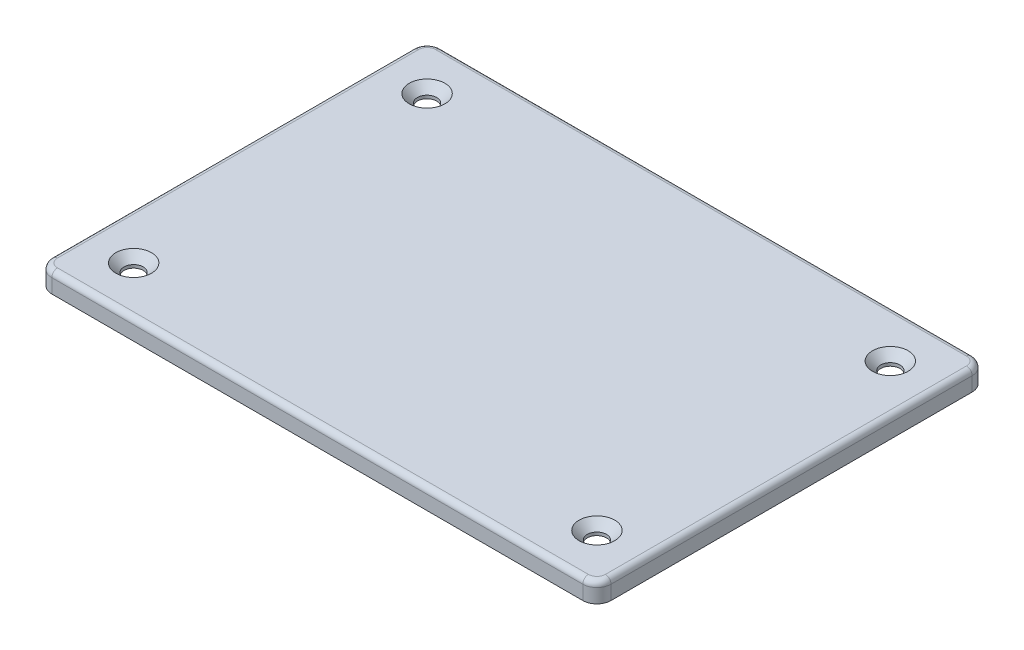
ISO-10303-21;
HEADER;
FILE_DESCRIPTION(('STEP AP214'),'2;1');
FILE_NAME('part.step','',(''),(''),'','','');
FILE_SCHEMA(('AUTOMOTIVE_DESIGN { 1 0 10303 214 1 1 1 1 }'));
ENDSEC;
DATA;
#1=APPLICATION_CONTEXT('core data for automotive mechanical design processes');
#2=APPLICATION_PROTOCOL_DEFINITION('international standard','automotive_design',2000,#1);
#3=PRODUCT_CONTEXT('',#1,'mechanical');
#4=PRODUCT('Part','Part','',(#3));
#5=PRODUCT_RELATED_PRODUCT_CATEGORY('part','',(#4));
#6=PRODUCT_DEFINITION_FORMATION('','',#4);
#7=PRODUCT_DEFINITION_CONTEXT('part definition',#1,'design');
#8=PRODUCT_DEFINITION('design','',#6,#7);
#9=PRODUCT_DEFINITION_SHAPE('','',#8);
#10=(LENGTH_UNIT() NAMED_UNIT(*) SI_UNIT(.MILLI.,.METRE.));
#11=(NAMED_UNIT(*) PLANE_ANGLE_UNIT() SI_UNIT($,.RADIAN.));
#12=(NAMED_UNIT(*) SI_UNIT($,.STERADIAN.) SOLID_ANGLE_UNIT());
#13=UNCERTAINTY_MEASURE_WITH_UNIT(LENGTH_MEASURE(1.E-05),#10,'distance_accuracy_value','');
#14=(GEOMETRIC_REPRESENTATION_CONTEXT(3) GLOBAL_UNCERTAINTY_ASSIGNED_CONTEXT((#13)) GLOBAL_UNIT_ASSIGNED_CONTEXT((#10,
#11,#12)) REPRESENTATION_CONTEXT('',''));
#15=CARTESIAN_POINT('',(0.,0.,0.));
#16=DIRECTION('',(0.,0.,1.));
#17=DIRECTION('',(1.,0.,0.));
#18=AXIS2_PLACEMENT_3D('',#15,#16,#17);
#19=CARTESIAN_POINT('',(0.,3.5,0.));
#20=DIRECTION('',(0.,1.,0.));
#21=DIRECTION('',(0.,0.,1.));
#22=AXIS2_PLACEMENT_3D('',#19,#20,#21);
#23=PLANE('',#22);
#24=CARTESIAN_POINT('',(-40.9119632626517,3.5,-25.9119632626518));
#25=DIRECTION('',(0.,1.,0.));
#26=DIRECTION('',(0.,0.,1.));
#27=AXIS2_PLACEMENT_3D('',#24,#25,#26);
#28=CIRCLE('',#27,3.15);
#29=CARTESIAN_POINT('',(-40.9119632626517,3.5,-22.7619632626518));
#30=VERTEX_POINT('',#29);
#31=EDGE_CURVE('E790',#30,#30,#28,.T.);
#32=ORIENTED_EDGE('',*,*,#31,.F.);
#33=EDGE_LOOP('',(#32));
#34=FACE_BOUND('',#33,.T.);
#35=CARTESIAN_POINT('',(40.911962807627,3.5,-25.9119632626518));
#36=DIRECTION('',(0.,1.,0.));
#37=DIRECTION('',(0.,0.,1.));
#38=AXIS2_PLACEMENT_3D('',#35,#36,#37);
#39=CIRCLE('',#38,3.15);
#40=CARTESIAN_POINT('',(40.911962807627,3.5,-22.7619632626518));
#41=VERTEX_POINT('',#40);
#42=EDGE_CURVE('E363',#41,#41,#39,.T.);
#43=ORIENTED_EDGE('',*,*,#42,.F.);
#44=EDGE_LOOP('',(#43));
#45=FACE_BOUND('',#44,.T.);
#46=CARTESIAN_POINT('',(40.911962807627,3.5,25.911962807627));
#47=DIRECTION('',(0.,1.,0.));
#48=DIRECTION('',(0.,0.,1.));
#49=AXIS2_PLACEMENT_3D('',#46,#47,#48);
#50=CIRCLE('',#49,3.15);
#51=CARTESIAN_POINT('',(40.911962807627,3.5,29.061962807627));
#52=VERTEX_POINT('',#51);
#53=EDGE_CURVE('E356',#52,#52,#50,.T.);
#54=ORIENTED_EDGE('',*,*,#53,.F.);
#55=EDGE_LOOP('',(#54));
#56=FACE_BOUND('',#55,.T.);
#57=CARTESIAN_POINT('',(-40.9119632626517,3.5,25.911962807627));
#58=DIRECTION('',(0.,1.,0.));
#59=DIRECTION('',(0.,0.,1.));
#60=AXIS2_PLACEMENT_3D('',#57,#58,#59);
#61=CIRCLE('',#60,3.15);
#62=CARTESIAN_POINT('',(-40.9119632626517,3.5,29.061962807627));
#63=VERTEX_POINT('',#62);
#64=EDGE_CURVE('E352',#63,#63,#61,.T.);
#65=ORIENTED_EDGE('',*,*,#64,.F.);
#66=EDGE_LOOP('',(#65));
#67=FACE_BOUND('',#66,.T.);
#68=CARTESIAN_POINT('',(46.8890725,3.5,-31.8890725));
#69=DIRECTION('',(0.,1.,0.));
#70=DIRECTION('',(0.,0.,1.));
#71=AXIS2_PLACEMENT_3D('',#68,#69,#70);
#72=CIRCLE('',#71,1.5);
#73=CARTESIAN_POINT('',(46.8890725,3.5,-33.3890725));
#74=VERTEX_POINT('',#73);
#75=CARTESIAN_POINT('',(48.3890725,3.5,-31.8890725));
#76=VERTEX_POINT('',#75);
#77=EDGE_CURVE('E303',#74,#76,#72,.F.);
#78=ORIENTED_EDGE('',*,*,#77,.F.);
#79=DIRECTION('',(-1.,0.,0.));
#80=VECTOR('',#79,1.);
#81=CARTESIAN_POINT('',(-49.3890725,3.5,-33.3890725));
#82=LINE('',#81,#80);
#83=CARTESIAN_POINT('',(-46.8890725,3.5,-33.3890725));
#84=VERTEX_POINT('',#83);
#85=EDGE_CURVE('E275',#74,#84,#82,.T.);
#86=ORIENTED_EDGE('',*,*,#85,.T.);
#87=CARTESIAN_POINT('',(-46.8890725,3.5,-31.8890725));
#88=DIRECTION('',(0.,1.,0.));
#89=DIRECTION('',(0.,0.,1.));
#90=AXIS2_PLACEMENT_3D('',#87,#88,#89);
#91=CIRCLE('',#90,1.5);
#92=CARTESIAN_POINT('',(-48.3890725,3.5,-31.8890725));
#93=VERTEX_POINT('',#92);
#94=EDGE_CURVE('E300',#93,#84,#91,.F.);
#95=ORIENTED_EDGE('',*,*,#94,.F.);
#96=DIRECTION('',(0.,0.,1.));
#97=VECTOR('',#96,1.);
#98=CARTESIAN_POINT('',(-48.3890725,3.5,34.3890725));
#99=LINE('',#98,#97);
#100=CARTESIAN_POINT('',(-48.3890725,3.5,31.8890725));
#101=VERTEX_POINT('',#100);
#102=EDGE_CURVE('E266',#93,#101,#99,.T.);
#103=ORIENTED_EDGE('',*,*,#102,.T.);
#104=CARTESIAN_POINT('',(-46.8890725,3.5,31.8890725));
#105=DIRECTION('',(0.,1.,0.));
#106=DIRECTION('',(0.,0.,1.));
#107=AXIS2_PLACEMENT_3D('',#104,#105,#106);
#108=CIRCLE('',#107,1.5);
#109=CARTESIAN_POINT('',(-46.8890725,3.5,33.3890725));
#110=VERTEX_POINT('',#109);
#111=EDGE_CURVE('E297',#110,#101,#108,.F.);
#112=ORIENTED_EDGE('',*,*,#111,.F.);
#113=DIRECTION('',(1.,0.,0.));
#114=VECTOR('',#113,1.);
#115=CARTESIAN_POINT('',(49.3890725,3.5,33.3890725));
#116=LINE('',#115,#114);
#117=CARTESIAN_POINT('',(46.8890725,3.5,33.3890725));
#118=VERTEX_POINT('',#117);
#119=EDGE_CURVE('E269',#110,#118,#116,.T.);
#120=ORIENTED_EDGE('',*,*,#119,.T.);
#121=CARTESIAN_POINT('',(46.8890725,3.5,31.8890725));
#122=DIRECTION('',(0.,1.,0.));
#123=DIRECTION('',(0.,0.,1.));
#124=AXIS2_PLACEMENT_3D('',#121,#122,#123);
#125=CIRCLE('',#124,1.5);
#126=CARTESIAN_POINT('',(48.3890725,3.5,31.8890725));
#127=VERTEX_POINT('',#126);
#128=EDGE_CURVE('E295',#127,#118,#125,.F.);
#129=ORIENTED_EDGE('',*,*,#128,.F.);
#130=DIRECTION('',(0.,0.,-1.));
#131=VECTOR('',#130,1.);
#132=CARTESIAN_POINT('',(48.3890725,3.5,-34.3890725));
#133=LINE('',#132,#131);
#134=EDGE_CURVE('E272',#127,#76,#133,.T.);
#135=ORIENTED_EDGE('',*,*,#134,.T.);
#136=EDGE_LOOP('',(#78,#86,#95,#103,#112,#120,#129,#135));
#137=FACE_BOUND('',#136,.T.);
#138=ADVANCED_FACE('F39',(#34,#45,#56,#67,#137),#23,.T.);
#139=CARTESIAN_POINT('',(-49.3890725,3.5,34.3890725));
#140=DIRECTION('',(1.,0.,0.));
#141=DIRECTION('',(0.,0.,-1.));
#142=AXIS2_PLACEMENT_3D('',#139,#140,#141);
#143=PLANE('',#142);
#144=DIRECTION('',(0.,0.,1.));
#145=VECTOR('',#144,1.);
#146=CARTESIAN_POINT('',(-49.3890725,0.,34.3890725));
#147=LINE('',#146,#145);
#148=CARTESIAN_POINT('',(-49.3890725,0.,-31.8890725));
#149=VERTEX_POINT('',#148);
#150=CARTESIAN_POINT('',(-49.3890725,0.,31.8890725));
#151=VERTEX_POINT('',#150);
#152=EDGE_CURVE('E254',#149,#151,#147,.T.);
#153=ORIENTED_EDGE('',*,*,#152,.T.);
#154=DIRECTION('',(0.,-1.,0.));
#155=VECTOR('',#154,1.);
#156=CARTESIAN_POINT('',(-49.3890725,3.5,31.8890725));
#157=LINE('',#156,#155);
#158=CARTESIAN_POINT('',(-49.3890725,2.5,31.8890725));
#159=VERTEX_POINT('',#158);
#160=EDGE_CURVE('E335',#151,#159,#157,.F.);
#161=ORIENTED_EDGE('',*,*,#160,.T.);
#162=DIRECTION('',(0.,0.,1.));
#163=VECTOR('',#162,1.);
#164=CARTESIAN_POINT('',(-49.3890725,2.5,-34.3890725));
#165=LINE('',#164,#163);
#166=CARTESIAN_POINT('',(-49.3890725,2.5,-31.8890725));
#167=VERTEX_POINT('',#166);
#168=EDGE_CURVE('E287',#159,#167,#165,.F.);
#169=ORIENTED_EDGE('',*,*,#168,.T.);
#170=DIRECTION('',(0.,-1.,0.));
#171=VECTOR('',#170,1.);
#172=CARTESIAN_POINT('',(-49.3890725,3.5,-31.8890725));
#173=LINE('',#172,#171);
#174=EDGE_CURVE('E333',#167,#149,#173,.T.);
#175=ORIENTED_EDGE('',*,*,#174,.T.);
#176=EDGE_LOOP('',(#153,#161,#169,#175));
#177=FACE_BOUND('',#176,.T.);
#178=ADVANCED_FACE('F394',(#177),#143,.F.);
#179=CARTESIAN_POINT('',(49.3890725,3.5,34.3890725));
#180=DIRECTION('',(0.,0.,-1.));
#181=DIRECTION('',(-1.,0.,0.));
#182=AXIS2_PLACEMENT_3D('',#179,#180,#181);
#183=PLANE('',#182);
#184=DIRECTION('',(1.,0.,0.));
#185=VECTOR('',#184,1.);
#186=CARTESIAN_POINT('',(49.3890725,0.,34.3890725));
#187=LINE('',#186,#185);
#188=CARTESIAN_POINT('',(-46.8890725,0.,34.3890725));
#189=VERTEX_POINT('',#188);
#190=CARTESIAN_POINT('',(46.8890725,0.,34.3890725));
#191=VERTEX_POINT('',#190);
#192=EDGE_CURVE('E257',#189,#191,#187,.T.);
#193=ORIENTED_EDGE('',*,*,#192,.T.);
#194=DIRECTION('',(0.,-1.,0.));
#195=VECTOR('',#194,1.);
#196=CARTESIAN_POINT('',(46.8890725,3.5,34.3890725));
#197=LINE('',#196,#195);
#198=CARTESIAN_POINT('',(46.8890725,2.5,34.3890725));
#199=VERTEX_POINT('',#198);
#200=EDGE_CURVE('E331',#191,#199,#197,.F.);
#201=ORIENTED_EDGE('',*,*,#200,.T.);
#202=DIRECTION('',(1.,0.,0.));
#203=VECTOR('',#202,1.);
#204=CARTESIAN_POINT('',(-49.3890725,2.5,34.3890725));
#205=LINE('',#204,#203);
#206=CARTESIAN_POINT('',(-46.8890725,2.5,34.3890725));
#207=VERTEX_POINT('',#206);
#208=EDGE_CURVE('E284',#199,#207,#205,.F.);
#209=ORIENTED_EDGE('',*,*,#208,.T.);
#210=DIRECTION('',(0.,-1.,0.));
#211=VECTOR('',#210,1.);
#212=CARTESIAN_POINT('',(-46.8890725,3.5,34.3890725));
#213=LINE('',#212,#211);
#214=EDGE_CURVE('E329',#207,#189,#213,.T.);
#215=ORIENTED_EDGE('',*,*,#214,.T.);
#216=EDGE_LOOP('',(#193,#201,#209,#215));
#217=FACE_BOUND('',#216,.T.);
#218=ADVANCED_FACE('F402',(#217),#183,.F.);
#219=CARTESIAN_POINT('',(49.3890725,3.5,34.3890725));
#220=DIRECTION('',(-1.,0.,0.));
#221=DIRECTION('',(0.,0.,1.));
#222=AXIS2_PLACEMENT_3D('',#219,#220,#221);
#223=PLANE('',#222);
#224=DIRECTION('',(0.,0.,-1.));
#225=VECTOR('',#224,1.);
#226=CARTESIAN_POINT('',(49.3890725,2.5,34.3890725));
#227=LINE('',#226,#225);
#228=CARTESIAN_POINT('',(49.3890725,2.5,-31.8890725));
#229=VERTEX_POINT('',#228);
#230=CARTESIAN_POINT('',(49.3890725,2.5,31.8890725));
#231=VERTEX_POINT('',#230);
#232=EDGE_CURVE('E281',#229,#231,#227,.F.);
#233=ORIENTED_EDGE('',*,*,#232,.T.);
#234=DIRECTION('',(0.,-1.,0.));
#235=VECTOR('',#234,1.);
#236=CARTESIAN_POINT('',(49.3890725,3.5,31.8890725));
#237=LINE('',#236,#235);
#238=CARTESIAN_POINT('',(49.3890725,0.,31.8890725));
#239=VERTEX_POINT('',#238);
#240=EDGE_CURVE('E320',#231,#239,#237,.T.);
#241=ORIENTED_EDGE('',*,*,#240,.T.);
#242=DIRECTION('',(0.,0.,-1.));
#243=VECTOR('',#242,1.);
#244=CARTESIAN_POINT('',(49.3890725,0.,34.3890725));
#245=LINE('',#244,#243);
#246=CARTESIAN_POINT('',(49.3890725,0.,-31.8890725));
#247=VERTEX_POINT('',#246);
#248=EDGE_CURVE('E260',#239,#247,#245,.T.);
#249=ORIENTED_EDGE('',*,*,#248,.T.);
#250=DIRECTION('',(0.,-1.,0.));
#251=VECTOR('',#250,1.);
#252=CARTESIAN_POINT('',(49.3890725,3.5,-31.8890725));
#253=LINE('',#252,#251);
#254=EDGE_CURVE('E318',#247,#229,#253,.F.);
#255=ORIENTED_EDGE('',*,*,#254,.T.);
#256=EDGE_LOOP('',(#233,#241,#249,#255));
#257=FACE_BOUND('',#256,.T.);
#258=ADVANCED_FACE('F418',(#257),#223,.F.);
#259=CARTESIAN_POINT('',(49.3890725,3.5,-34.3890725));
#260=DIRECTION('',(0.,0.,1.));
#261=DIRECTION('',(1.,0.,0.));
#262=AXIS2_PLACEMENT_3D('',#259,#260,#261);
#263=PLANE('',#262);
#264=DIRECTION('',(-1.,0.,0.));
#265=VECTOR('',#264,1.);
#266=CARTESIAN_POINT('',(49.3890725,0.,-34.3890725));
#267=LINE('',#266,#265);
#268=CARTESIAN_POINT('',(46.8890725,0.,-34.3890725));
#269=VERTEX_POINT('',#268);
#270=CARTESIAN_POINT('',(-46.8890725,0.,-34.3890725));
#271=VERTEX_POINT('',#270);
#272=EDGE_CURVE('E263',#269,#271,#267,.T.);
#273=ORIENTED_EDGE('',*,*,#272,.T.);
#274=DIRECTION('',(0.,-1.,0.));
#275=VECTOR('',#274,1.);
#276=CARTESIAN_POINT('',(-46.8890725,3.5,-34.3890725));
#277=LINE('',#276,#275);
#278=CARTESIAN_POINT('',(-46.8890725,2.5,-34.3890725));
#279=VERTEX_POINT('',#278);
#280=EDGE_CURVE('E11',#271,#279,#277,.F.);
#281=ORIENTED_EDGE('',*,*,#280,.T.);
#282=DIRECTION('',(-1.,0.,0.));
#283=VECTOR('',#282,1.);
#284=CARTESIAN_POINT('',(49.3890725,2.5,-34.3890725));
#285=LINE('',#284,#283);
#286=CARTESIAN_POINT('',(46.8890725,2.5,-34.3890725));
#287=VERTEX_POINT('',#286);
#288=EDGE_CURVE('E278',#279,#287,#285,.F.);
#289=ORIENTED_EDGE('',*,*,#288,.T.);
#290=DIRECTION('',(0.,-1.,0.));
#291=VECTOR('',#290,1.);
#292=CARTESIAN_POINT('',(46.8890725,3.5,-34.3890725));
#293=LINE('',#292,#291);
#294=EDGE_CURVE('E48',#287,#269,#293,.T.);
#295=ORIENTED_EDGE('',*,*,#294,.T.);
#296=EDGE_LOOP('',(#273,#281,#289,#295));
#297=FACE_BOUND('',#296,.T.);
#298=ADVANCED_FACE('F414',(#297),#263,.F.);
#299=CARTESIAN_POINT('',(0.,0.,0.));
#300=DIRECTION('',(0.,1.,0.));
#301=DIRECTION('',(0.,0.,1.));
#302=AXIS2_PLACEMENT_3D('',#299,#300,#301);
#303=PLANE('',#302);
#304=DIRECTION('',(0.,0.,1.));
#305=VECTOR('',#304,1.);
#306=CARTESIAN_POINT('',(47.8890725,0.,-31.8890725));
#307=LINE('',#306,#305);
#308=CARTESIAN_POINT('',(47.8890725,0.,-31.8890725));
#309=VERTEX_POINT('',#308);
#310=CARTESIAN_POINT('',(47.8890725,0.,31.8890725));
#311=VERTEX_POINT('',#310);
#312=EDGE_CURVE('E223',#309,#311,#307,.T.);
#313=ORIENTED_EDGE('',*,*,#312,.F.);
#314=CARTESIAN_POINT('',(46.8890725,0.,-31.8890725));
#315=DIRECTION('',(0.,-1.,0.));
#316=DIRECTION('',(0.,0.,-1.));
#317=AXIS2_PLACEMENT_3D('',#314,#315,#316);
#318=CIRCLE('',#317,1.);
#319=CARTESIAN_POINT('',(46.8890725,0.,-32.8890725));
#320=VERTEX_POINT('',#319);
#321=EDGE_CURVE('E56',#320,#309,#318,.T.);
#322=ORIENTED_EDGE('',*,*,#321,.F.);
#323=DIRECTION('',(1.,0.,0.));
#324=VECTOR('',#323,1.);
#325=CARTESIAN_POINT('',(-46.8890725,0.,-32.8890725));
#326=LINE('',#325,#324);
#327=CARTESIAN_POINT('',(-46.8890725,0.,-32.8890725));
#328=VERTEX_POINT('',#327);
#329=EDGE_CURVE('E200',#328,#320,#326,.T.);
#330=ORIENTED_EDGE('',*,*,#329,.F.);
#331=CARTESIAN_POINT('',(-46.8890725,0.,-31.8890725));
#332=DIRECTION('',(0.,-1.,0.));
#333=DIRECTION('',(0.,0.,-1.));
#334=AXIS2_PLACEMENT_3D('',#331,#332,#333);
#335=CIRCLE('',#334,1.);
#336=CARTESIAN_POINT('',(-47.8890725,0.,-31.8890725));
#337=VERTEX_POINT('',#336);
#338=EDGE_CURVE('E203',#337,#328,#335,.T.);
#339=ORIENTED_EDGE('',*,*,#338,.F.);
#340=DIRECTION('',(0.,0.,-1.));
#341=VECTOR('',#340,1.);
#342=CARTESIAN_POINT('',(-47.8890725,0.,31.8890725));
#343=LINE('',#342,#341);
#344=CARTESIAN_POINT('',(-47.8890725,0.,31.8890725));
#345=VERTEX_POINT('',#344);
#346=EDGE_CURVE('E235',#345,#337,#343,.T.);
#347=ORIENTED_EDGE('',*,*,#346,.F.);
#348=CARTESIAN_POINT('',(-46.8890725,0.,31.8890725));
#349=DIRECTION('',(0.,-1.,0.));
#350=DIRECTION('',(0.,0.,-1.));
#351=AXIS2_PLACEMENT_3D('',#348,#349,#350);
#352=CIRCLE('',#351,1.);
#353=CARTESIAN_POINT('',(-46.8890725,0.,32.8890725));
#354=VERTEX_POINT('',#353);
#355=EDGE_CURVE('E232',#354,#345,#352,.T.);
#356=ORIENTED_EDGE('',*,*,#355,.F.);
#357=DIRECTION('',(-1.,0.,0.));
#358=VECTOR('',#357,1.);
#359=CARTESIAN_POINT('',(46.8890725,0.,32.8890725));
#360=LINE('',#359,#358);
#361=CARTESIAN_POINT('',(46.8890725,0.,32.8890725));
#362=VERTEX_POINT('',#361);
#363=EDGE_CURVE('E229',#362,#354,#360,.T.);
#364=ORIENTED_EDGE('',*,*,#363,.F.);
#365=CARTESIAN_POINT('',(46.8890725,0.,31.8890725));
#366=DIRECTION('',(0.,-1.,0.));
#367=DIRECTION('',(0.,0.,-1.));
#368=AXIS2_PLACEMENT_3D('',#365,#366,#367);
#369=CIRCLE('',#368,1.);
#370=EDGE_CURVE('E226',#311,#362,#369,.T.);
#371=ORIENTED_EDGE('',*,*,#370,.F.);
#372=EDGE_LOOP('',(#313,#322,#330,#339,#347,#356,#364,#371));
#373=FACE_BOUND('',#372,.T.);
#374=ORIENTED_EDGE('',*,*,#248,.F.);
#375=CARTESIAN_POINT('',(46.8890725,0.,31.8890725));
#376=DIRECTION('',(0.,1.,0.));
#377=DIRECTION('',(0.,0.,1.));
#378=AXIS2_PLACEMENT_3D('',#375,#376,#377);
#379=CIRCLE('',#378,2.5);
#380=EDGE_CURVE('E64',#239,#191,#379,.F.);
#381=ORIENTED_EDGE('',*,*,#380,.T.);
#382=ORIENTED_EDGE('',*,*,#192,.F.);
#383=CARTESIAN_POINT('',(-46.8890725,0.,31.8890725));
#384=DIRECTION('',(0.,1.,0.));
#385=DIRECTION('',(0.,0.,1.));
#386=AXIS2_PLACEMENT_3D('',#383,#384,#385);
#387=CIRCLE('',#386,2.5);
#388=EDGE_CURVE('E326',#189,#151,#387,.F.);
#389=ORIENTED_EDGE('',*,*,#388,.T.);
#390=ORIENTED_EDGE('',*,*,#152,.F.);
#391=CARTESIAN_POINT('',(-46.8890725,0.,-31.8890725));
#392=DIRECTION('',(0.,1.,0.));
#393=DIRECTION('',(0.,0.,1.));
#394=AXIS2_PLACEMENT_3D('',#391,#392,#393);
#395=CIRCLE('',#394,2.5);
#396=EDGE_CURVE('E324',#149,#271,#395,.F.);
#397=ORIENTED_EDGE('',*,*,#396,.T.);
#398=ORIENTED_EDGE('',*,*,#272,.F.);
#399=CARTESIAN_POINT('',(46.8890725,0.,-31.8890725));
#400=DIRECTION('',(0.,1.,0.));
#401=DIRECTION('',(0.,0.,1.));
#402=AXIS2_PLACEMENT_3D('',#399,#400,#401);
#403=CIRCLE('',#402,2.5);
#404=EDGE_CURVE('E322',#269,#247,#403,.F.);
#405=ORIENTED_EDGE('',*,*,#404,.T.);
#406=EDGE_LOOP('',(#374,#381,#382,#389,#390,#397,#398,#405));
#407=FACE_BOUND('',#406,.T.);
#408=ADVANCED_FACE('F410',(#373,#407),#303,.F.);
#409=CARTESIAN_POINT('',(0.,2.5,33.3890725));
#410=DIRECTION('',(-1.,0.,0.));
#411=DIRECTION('',(0.,0.,1.));
#412=AXIS2_PLACEMENT_3D('',#409,#410,#411);
#413=CYLINDRICAL_SURFACE('',#412,1.);
#414=ORIENTED_EDGE('',*,*,#208,.F.);
#415=CARTESIAN_POINT('',(46.8890725,2.5,33.3890725));
#416=DIRECTION('',(-1.,0.,0.));
#417=DIRECTION('',(0.,0.,1.));
#418=AXIS2_PLACEMENT_3D('',#415,#416,#417);
#419=CIRCLE('',#418,1.);
#420=EDGE_CURVE('E315',#199,#118,#419,.T.);
#421=ORIENTED_EDGE('',*,*,#420,.T.);
#422=ORIENTED_EDGE('',*,*,#119,.F.);
#423=CARTESIAN_POINT('',(-46.8890725,2.5,33.3890725));
#424=DIRECTION('',(1.,0.,0.));
#425=DIRECTION('',(0.,0.,-1.));
#426=AXIS2_PLACEMENT_3D('',#423,#424,#425);
#427=CIRCLE('',#426,1.);
#428=EDGE_CURVE('E313',#110,#207,#427,.T.);
#429=ORIENTED_EDGE('',*,*,#428,.T.);
#430=EDGE_LOOP('',(#414,#421,#422,#429));
#431=FACE_BOUND('',#430,.T.);
#432=ADVANCED_FACE('F413',(#431),#413,.T.);
#433=CARTESIAN_POINT('',(48.3890725,2.5,0.));
#434=DIRECTION('',(0.,0.,1.));
#435=DIRECTION('',(1.,0.,0.));
#436=AXIS2_PLACEMENT_3D('',#433,#434,#435);
#437=CYLINDRICAL_SURFACE('',#436,1.);
#438=ORIENTED_EDGE('',*,*,#232,.F.);
#439=CARTESIAN_POINT('',(48.3890725,2.5,-31.8890725));
#440=DIRECTION('',(0.,0.,1.));
#441=DIRECTION('',(1.,0.,0.));
#442=AXIS2_PLACEMENT_3D('',#439,#440,#441);
#443=CIRCLE('',#442,1.);
#444=EDGE_CURVE('E292',#229,#76,#443,.T.);
#445=ORIENTED_EDGE('',*,*,#444,.T.);
#446=ORIENTED_EDGE('',*,*,#134,.F.);
#447=CARTESIAN_POINT('',(48.3890725,2.5,31.8890725));
#448=DIRECTION('',(0.,0.,-1.));
#449=DIRECTION('',(-1.,0.,0.));
#450=AXIS2_PLACEMENT_3D('',#447,#448,#449);
#451=CIRCLE('',#450,1.);
#452=EDGE_CURVE('E290',#127,#231,#451,.T.);
#453=ORIENTED_EDGE('',*,*,#452,.T.);
#454=EDGE_LOOP('',(#438,#445,#446,#453));
#455=FACE_BOUND('',#454,.T.);
#456=ADVANCED_FACE('F434',(#455),#437,.T.);
#457=CARTESIAN_POINT('',(-48.3890725,2.5,0.));
#458=DIRECTION('',(0.,0.,-1.));
#459=DIRECTION('',(-1.,0.,0.));
#460=AXIS2_PLACEMENT_3D('',#457,#458,#459);
#461=CYLINDRICAL_SURFACE('',#460,1.);
#462=ORIENTED_EDGE('',*,*,#168,.F.);
#463=CARTESIAN_POINT('',(-48.3890725,2.5,31.8890725));
#464=DIRECTION('',(0.,0.,-1.));
#465=DIRECTION('',(-1.,0.,0.));
#466=AXIS2_PLACEMENT_3D('',#463,#464,#465);
#467=CIRCLE('',#466,1.);
#468=EDGE_CURVE('E311',#159,#101,#467,.T.);
#469=ORIENTED_EDGE('',*,*,#468,.T.);
#470=ORIENTED_EDGE('',*,*,#102,.F.);
#471=CARTESIAN_POINT('',(-48.3890725,2.5,-31.8890725));
#472=DIRECTION('',(0.,0.,1.));
#473=DIRECTION('',(1.,0.,0.));
#474=AXIS2_PLACEMENT_3D('',#471,#472,#473);
#475=CIRCLE('',#474,1.);
#476=EDGE_CURVE('E309',#93,#167,#475,.T.);
#477=ORIENTED_EDGE('',*,*,#476,.T.);
#478=EDGE_LOOP('',(#462,#469,#470,#477));
#479=FACE_BOUND('',#478,.T.);
#480=ADVANCED_FACE('F430',(#479),#461,.T.);
#481=CARTESIAN_POINT('',(0.,2.5,-33.3890725));
#482=DIRECTION('',(1.,0.,0.));
#483=DIRECTION('',(0.,0.,-1.));
#484=AXIS2_PLACEMENT_3D('',#481,#482,#483);
#485=CYLINDRICAL_SURFACE('',#484,1.);
#486=ORIENTED_EDGE('',*,*,#288,.F.);
#487=CARTESIAN_POINT('',(-46.8890725,2.5,-33.3890725));
#488=DIRECTION('',(1.,0.,0.));
#489=DIRECTION('',(0.,0.,-1.));
#490=AXIS2_PLACEMENT_3D('',#487,#488,#489);
#491=CIRCLE('',#490,1.);
#492=EDGE_CURVE('E307',#279,#84,#491,.T.);
#493=ORIENTED_EDGE('',*,*,#492,.T.);
#494=ORIENTED_EDGE('',*,*,#85,.F.);
#495=CARTESIAN_POINT('',(46.8890725,2.5,-33.3890725));
#496=DIRECTION('',(-1.,0.,0.));
#497=DIRECTION('',(0.,0.,1.));
#498=AXIS2_PLACEMENT_3D('',#495,#496,#497);
#499=CIRCLE('',#498,1.);
#500=EDGE_CURVE('E305',#74,#287,#499,.T.);
#501=ORIENTED_EDGE('',*,*,#500,.T.);
#502=EDGE_LOOP('',(#486,#493,#494,#501));
#503=FACE_BOUND('',#502,.T.);
#504=ADVANCED_FACE('F426',(#503),#485,.T.);
#505=CARTESIAN_POINT('',(46.8890725,3.5,-31.8890725));
#506=DIRECTION('',(0.,-1.,0.));
#507=DIRECTION('',(0.,0.,-1.));
#508=AXIS2_PLACEMENT_3D('',#505,#506,#507);
#509=CYLINDRICAL_SURFACE('',#508,2.5);
#510=ORIENTED_EDGE('',*,*,#404,.F.);
#511=ORIENTED_EDGE('',*,*,#294,.F.);
#512=CARTESIAN_POINT('',(46.8890725,2.5,-31.8890725));
#513=DIRECTION('',(0.,1.,0.));
#514=DIRECTION('',(0.,0.,1.));
#515=AXIS2_PLACEMENT_3D('',#512,#513,#514);
#516=CIRCLE('',#515,2.5);
#517=EDGE_CURVE('E258',#229,#287,#516,.T.);
#518=ORIENTED_EDGE('',*,*,#517,.F.);
#519=ORIENTED_EDGE('',*,*,#254,.F.);
#520=EDGE_LOOP('',(#510,#511,#518,#519));
#521=FACE_BOUND('',#520,.T.);
#522=ADVANCED_FACE('F429',(#521),#509,.T.);
#523=CARTESIAN_POINT('',(46.8890725,2.5,-31.8890725));
#524=DIRECTION('',(0.,1.,0.));
#525=DIRECTION('',(0.,0.,1.));
#526=AXIS2_PLACEMENT_3D('',#523,#524,#525);
#527=TOROIDAL_SURFACE('',#526,1.5,1.);
#528=ORIENTED_EDGE('',*,*,#444,.F.);
#529=ORIENTED_EDGE('',*,*,#517,.T.);
#530=ORIENTED_EDGE('',*,*,#500,.F.);
#531=ORIENTED_EDGE('',*,*,#77,.T.);
#532=EDGE_LOOP('',(#528,#529,#530,#531));
#533=FACE_BOUND('',#532,.T.);
#534=ADVANCED_FACE('F442',(#533),#527,.T.);
#535=CARTESIAN_POINT('',(-46.8890725,3.5,-31.8890725));
#536=DIRECTION('',(0.,-1.,0.));
#537=DIRECTION('',(0.,0.,-1.));
#538=AXIS2_PLACEMENT_3D('',#535,#536,#537);
#539=CYLINDRICAL_SURFACE('',#538,2.5);
#540=ORIENTED_EDGE('',*,*,#396,.F.);
#541=ORIENTED_EDGE('',*,*,#174,.F.);
#542=CARTESIAN_POINT('',(-46.8890725,2.5,-31.8890725));
#543=DIRECTION('',(0.,1.,0.));
#544=DIRECTION('',(0.,0.,1.));
#545=AXIS2_PLACEMENT_3D('',#542,#543,#544);
#546=CIRCLE('',#545,2.5);
#547=EDGE_CURVE('E340',#279,#167,#546,.T.);
#548=ORIENTED_EDGE('',*,*,#547,.F.);
#549=ORIENTED_EDGE('',*,*,#280,.F.);
#550=EDGE_LOOP('',(#540,#541,#548,#549));
#551=FACE_BOUND('',#550,.T.);
#552=ADVANCED_FACE('F445',(#551),#539,.T.);
#553=CARTESIAN_POINT('',(-46.8890725,2.5,-31.8890725));
#554=DIRECTION('',(0.,1.,0.));
#555=DIRECTION('',(0.,0.,1.));
#556=AXIS2_PLACEMENT_3D('',#553,#554,#555);
#557=TOROIDAL_SURFACE('',#556,1.5,1.);
#558=ORIENTED_EDGE('',*,*,#476,.F.);
#559=ORIENTED_EDGE('',*,*,#94,.T.);
#560=ORIENTED_EDGE('',*,*,#492,.F.);
#561=ORIENTED_EDGE('',*,*,#547,.T.);
#562=EDGE_LOOP('',(#558,#559,#560,#561));
#563=FACE_BOUND('',#562,.T.);
#564=ADVANCED_FACE('F450',(#563),#557,.T.);
#565=CARTESIAN_POINT('',(-46.8890725,3.5,31.8890725));
#566=DIRECTION('',(0.,-1.,0.));
#567=DIRECTION('',(0.,0.,-1.));
#568=AXIS2_PLACEMENT_3D('',#565,#566,#567);
#569=CYLINDRICAL_SURFACE('',#568,2.5);
#570=ORIENTED_EDGE('',*,*,#388,.F.);
#571=ORIENTED_EDGE('',*,*,#214,.F.);
#572=CARTESIAN_POINT('',(-46.8890725,2.5,31.8890725));
#573=DIRECTION('',(0.,1.,0.));
#574=DIRECTION('',(0.,0.,1.));
#575=AXIS2_PLACEMENT_3D('',#572,#573,#574);
#576=CIRCLE('',#575,2.5);
#577=EDGE_CURVE('E343',#159,#207,#576,.T.);
#578=ORIENTED_EDGE('',*,*,#577,.F.);
#579=ORIENTED_EDGE('',*,*,#160,.F.);
#580=EDGE_LOOP('',(#570,#571,#578,#579));
#581=FACE_BOUND('',#580,.T.);
#582=ADVANCED_FACE('F453',(#581),#569,.T.);
#583=CARTESIAN_POINT('',(-46.8890725,2.5,31.8890725));
#584=DIRECTION('',(0.,1.,0.));
#585=DIRECTION('',(0.,0.,1.));
#586=AXIS2_PLACEMENT_3D('',#583,#584,#585);
#587=TOROIDAL_SURFACE('',#586,1.5,1.);
#588=ORIENTED_EDGE('',*,*,#428,.F.);
#589=ORIENTED_EDGE('',*,*,#111,.T.);
#590=ORIENTED_EDGE('',*,*,#468,.F.);
#591=ORIENTED_EDGE('',*,*,#577,.T.);
#592=EDGE_LOOP('',(#588,#589,#590,#591));
#593=FACE_BOUND('',#592,.T.);
#594=ADVANCED_FACE('F458',(#593),#587,.T.);
#595=CARTESIAN_POINT('',(46.8890725,3.5,31.8890725));
#596=DIRECTION('',(0.,-1.,0.));
#597=DIRECTION('',(0.,0.,-1.));
#598=AXIS2_PLACEMENT_3D('',#595,#596,#597);
#599=CYLINDRICAL_SURFACE('',#598,2.5);
#600=ORIENTED_EDGE('',*,*,#380,.F.);
#601=ORIENTED_EDGE('',*,*,#240,.F.);
#602=CARTESIAN_POINT('',(46.8890725,2.5,31.8890725));
#603=DIRECTION('',(0.,1.,0.));
#604=DIRECTION('',(0.,0.,1.));
#605=AXIS2_PLACEMENT_3D('',#602,#603,#604);
#606=CIRCLE('',#605,2.5);
#607=EDGE_CURVE('E242',#199,#231,#606,.T.);
#608=ORIENTED_EDGE('',*,*,#607,.F.);
#609=ORIENTED_EDGE('',*,*,#200,.F.);
#610=EDGE_LOOP('',(#600,#601,#608,#609));
#611=FACE_BOUND('',#610,.T.);
#612=ADVANCED_FACE('F41',(#611),#599,.T.);
#613=CARTESIAN_POINT('',(46.8890725,2.5,31.8890725));
#614=DIRECTION('',(0.,1.,0.));
#615=DIRECTION('',(0.,0.,1.));
#616=AXIS2_PLACEMENT_3D('',#613,#614,#615);
#617=TOROIDAL_SURFACE('',#616,1.5,1.);
#618=ORIENTED_EDGE('',*,*,#420,.F.);
#619=ORIENTED_EDGE('',*,*,#607,.T.);
#620=ORIENTED_EDGE('',*,*,#452,.F.);
#621=ORIENTED_EDGE('',*,*,#128,.T.);
#622=EDGE_LOOP('',(#618,#619,#620,#621));
#623=FACE_BOUND('',#622,.T.);
#624=ADVANCED_FACE('F464',(#623),#617,.T.);
#625=CARTESIAN_POINT('',(46.8890725,1.5,-31.8890725));
#626=DIRECTION('',(0.,-1.,0.));
#627=DIRECTION('',(0.,0.,-1.));
#628=AXIS2_PLACEMENT_3D('',#625,#626,#627);
#629=CYLINDRICAL_SURFACE('',#628,1.);
#630=ORIENTED_EDGE('',*,*,#321,.T.);
#631=DIRECTION('',(0.,-1.,0.));
#632=VECTOR('',#631,1.);
#633=CARTESIAN_POINT('',(47.8890725,1.5,-31.8890725));
#634=LINE('',#633,#632);
#635=CARTESIAN_POINT('',(47.8890725,1.5,-31.8890725));
#636=VERTEX_POINT('',#635);
#637=EDGE_CURVE('E177',#636,#309,#634,.T.);
#638=ORIENTED_EDGE('',*,*,#637,.F.);
#639=CARTESIAN_POINT('',(46.8890725,1.5,-31.8890725));
#640=DIRECTION('',(0.,-1.,0.));
#641=DIRECTION('',(0.,0.,-1.));
#642=AXIS2_PLACEMENT_3D('',#639,#640,#641);
#643=CIRCLE('',#642,1.);
#644=CARTESIAN_POINT('',(46.8890725,1.5,-32.8890725));
#645=VERTEX_POINT('',#644);
#646=EDGE_CURVE('E181',#645,#636,#643,.T.);
#647=ORIENTED_EDGE('',*,*,#646,.F.);
#648=DIRECTION('',(0.,-1.,0.));
#649=VECTOR('',#648,1.);
#650=CARTESIAN_POINT('',(46.8890725,1.5,-32.8890725));
#651=LINE('',#650,#649);
#652=EDGE_CURVE('E240',#645,#320,#651,.T.);
#653=ORIENTED_EDGE('',*,*,#652,.T.);
#654=EDGE_LOOP('',(#630,#638,#647,#653));
#655=FACE_BOUND('',#654,.T.);
#656=ADVANCED_FACE('F179',(#655),#629,.F.);
#657=CARTESIAN_POINT('',(-46.8890725,1.5,-32.8890725));
#658=DIRECTION('',(0.,0.,-1.));
#659=DIRECTION('',(-1.,0.,0.));
#660=AXIS2_PLACEMENT_3D('',#657,#658,#659);
#661=PLANE('',#660);
#662=ORIENTED_EDGE('',*,*,#329,.T.);
#663=ORIENTED_EDGE('',*,*,#652,.F.);
#664=DIRECTION('',(1.,0.,0.));
#665=VECTOR('',#664,1.);
#666=CARTESIAN_POINT('',(-46.8890725,1.5,-32.8890725));
#667=LINE('',#666,#665);
#668=CARTESIAN_POINT('',(-46.8890725,1.5,-32.8890725));
#669=VERTEX_POINT('',#668);
#670=EDGE_CURVE('E187',#669,#645,#667,.T.);
#671=ORIENTED_EDGE('',*,*,#670,.F.);
#672=DIRECTION('',(0.,-1.,0.));
#673=VECTOR('',#672,1.);
#674=CARTESIAN_POINT('',(-46.8890725,1.5,-32.8890725));
#675=LINE('',#674,#673);
#676=EDGE_CURVE('E243',#669,#328,#675,.T.);
#677=ORIENTED_EDGE('',*,*,#676,.T.);
#678=EDGE_LOOP('',(#662,#663,#671,#677));
#679=FACE_BOUND('',#678,.T.);
#680=ADVANCED_FACE('F471',(#679),#661,.F.);
#681=CARTESIAN_POINT('',(-46.8890725,1.5,-31.8890725));
#682=DIRECTION('',(0.,-1.,0.));
#683=DIRECTION('',(0.,0.,-1.));
#684=AXIS2_PLACEMENT_3D('',#681,#682,#683);
#685=CYLINDRICAL_SURFACE('',#684,1.);
#686=ORIENTED_EDGE('',*,*,#338,.T.);
#687=ORIENTED_EDGE('',*,*,#676,.F.);
#688=CARTESIAN_POINT('',(-46.8890725,1.5,-31.8890725));
#689=DIRECTION('',(0.,-1.,0.));
#690=DIRECTION('',(0.,0.,-1.));
#691=AXIS2_PLACEMENT_3D('',#688,#689,#690);
#692=CIRCLE('',#691,1.);
#693=CARTESIAN_POINT('',(-47.8890725,1.5,-31.8890725));
#694=VERTEX_POINT('',#693);
#695=EDGE_CURVE('E219',#694,#669,#692,.T.);
#696=ORIENTED_EDGE('',*,*,#695,.F.);
#697=DIRECTION('',(0.,-1.,0.));
#698=VECTOR('',#697,1.);
#699=CARTESIAN_POINT('',(-47.8890725,1.5,-31.8890725));
#700=LINE('',#699,#698);
#701=EDGE_CURVE('E245',#694,#337,#700,.T.);
#702=ORIENTED_EDGE('',*,*,#701,.T.);
#703=EDGE_LOOP('',(#686,#687,#696,#702));
#704=FACE_BOUND('',#703,.T.);
#705=ADVANCED_FACE('F632',(#704),#685,.F.);
#706=CARTESIAN_POINT('',(-47.8890725,1.5,31.8890725));
#707=DIRECTION('',(-1.,0.,0.));
#708=DIRECTION('',(0.,0.,1.));
#709=AXIS2_PLACEMENT_3D('',#706,#707,#708);
#710=PLANE('',#709);
#711=ORIENTED_EDGE('',*,*,#346,.T.);
#712=ORIENTED_EDGE('',*,*,#701,.F.);
#713=DIRECTION('',(0.,0.,-1.));
#714=VECTOR('',#713,1.);
#715=CARTESIAN_POINT('',(-47.8890725,1.5,31.8890725));
#716=LINE('',#715,#714);
#717=CARTESIAN_POINT('',(-47.8890725,1.5,31.8890725));
#718=VERTEX_POINT('',#717);
#719=EDGE_CURVE('E216',#718,#694,#716,.T.);
#720=ORIENTED_EDGE('',*,*,#719,.F.);
#721=DIRECTION('',(0.,-1.,0.));
#722=VECTOR('',#721,1.);
#723=CARTESIAN_POINT('',(-47.8890725,1.5,31.8890725));
#724=LINE('',#723,#722);
#725=EDGE_CURVE('E247',#718,#345,#724,.T.);
#726=ORIENTED_EDGE('',*,*,#725,.T.);
#727=EDGE_LOOP('',(#711,#712,#720,#726));
#728=FACE_BOUND('',#727,.T.);
#729=ADVANCED_FACE('F643',(#728),#710,.F.);
#730=CARTESIAN_POINT('',(-46.8890725,1.5,31.8890725));
#731=DIRECTION('',(0.,-1.,0.));
#732=DIRECTION('',(0.,0.,-1.));
#733=AXIS2_PLACEMENT_3D('',#730,#731,#732);
#734=CYLINDRICAL_SURFACE('',#733,1.);
#735=ORIENTED_EDGE('',*,*,#355,.T.);
#736=ORIENTED_EDGE('',*,*,#725,.F.);
#737=CARTESIAN_POINT('',(-46.8890725,1.5,31.8890725));
#738=DIRECTION('',(0.,-1.,0.));
#739=DIRECTION('',(0.,0.,-1.));
#740=AXIS2_PLACEMENT_3D('',#737,#738,#739);
#741=CIRCLE('',#740,1.);
#742=CARTESIAN_POINT('',(-46.8890725,1.5,32.8890725));
#743=VERTEX_POINT('',#742);
#744=EDGE_CURVE('E213',#743,#718,#741,.T.);
#745=ORIENTED_EDGE('',*,*,#744,.F.);
#746=DIRECTION('',(0.,-1.,0.));
#747=VECTOR('',#746,1.);
#748=CARTESIAN_POINT('',(-46.8890725,1.5,32.8890725));
#749=LINE('',#748,#747);
#750=EDGE_CURVE('E249',#743,#354,#749,.T.);
#751=ORIENTED_EDGE('',*,*,#750,.T.);
#752=EDGE_LOOP('',(#735,#736,#745,#751));
#753=FACE_BOUND('',#752,.T.);
#754=ADVANCED_FACE('F654',(#753),#734,.F.);
#755=CARTESIAN_POINT('',(46.8890725,1.5,32.8890725));
#756=DIRECTION('',(0.,0.,1.));
#757=DIRECTION('',(1.,0.,0.));
#758=AXIS2_PLACEMENT_3D('',#755,#756,#757);
#759=PLANE('',#758);
#760=ORIENTED_EDGE('',*,*,#363,.T.);
#761=ORIENTED_EDGE('',*,*,#750,.F.);
#762=DIRECTION('',(-1.,0.,0.));
#763=VECTOR('',#762,1.);
#764=CARTESIAN_POINT('',(46.8890725,1.5,32.8890725));
#765=LINE('',#764,#763);
#766=CARTESIAN_POINT('',(46.8890725,1.5,32.8890725));
#767=VERTEX_POINT('',#766);
#768=EDGE_CURVE('E210',#767,#743,#765,.T.);
#769=ORIENTED_EDGE('',*,*,#768,.F.);
#770=DIRECTION('',(0.,-1.,0.));
#771=VECTOR('',#770,1.);
#772=CARTESIAN_POINT('',(46.8890725,1.5,32.8890725));
#773=LINE('',#772,#771);
#774=EDGE_CURVE('E251',#767,#362,#773,.T.);
#775=ORIENTED_EDGE('',*,*,#774,.T.);
#776=EDGE_LOOP('',(#760,#761,#769,#775));
#777=FACE_BOUND('',#776,.T.);
#778=ADVANCED_FACE('F665',(#777),#759,.F.);
#779=CARTESIAN_POINT('',(46.8890725,1.5,31.8890725));
#780=DIRECTION('',(0.,-1.,0.));
#781=DIRECTION('',(0.,0.,-1.));
#782=AXIS2_PLACEMENT_3D('',#779,#780,#781);
#783=CYLINDRICAL_SURFACE('',#782,1.);
#784=ORIENTED_EDGE('',*,*,#370,.T.);
#785=ORIENTED_EDGE('',*,*,#774,.F.);
#786=CARTESIAN_POINT('',(46.8890725,1.5,31.8890725));
#787=DIRECTION('',(0.,-1.,0.));
#788=DIRECTION('',(0.,0.,-1.));
#789=AXIS2_PLACEMENT_3D('',#786,#787,#788);
#790=CIRCLE('',#789,1.);
#791=CARTESIAN_POINT('',(47.8890725,1.5,31.8890725));
#792=VERTEX_POINT('',#791);
#793=EDGE_CURVE('E195',#792,#767,#790,.T.);
#794=ORIENTED_EDGE('',*,*,#793,.F.);
#795=DIRECTION('',(0.,-1.,0.));
#796=VECTOR('',#795,1.);
#797=CARTESIAN_POINT('',(47.8890725,1.5,31.8890725));
#798=LINE('',#797,#796);
#799=EDGE_CURVE('E186',#792,#311,#798,.T.);
#800=ORIENTED_EDGE('',*,*,#799,.T.);
#801=EDGE_LOOP('',(#784,#785,#794,#800));
#802=FACE_BOUND('',#801,.T.);
#803=ADVANCED_FACE('F676',(#802),#783,.F.);
#804=CARTESIAN_POINT('',(47.8890725,1.5,-31.8890725));
#805=DIRECTION('',(1.,0.,0.));
#806=DIRECTION('',(0.,0.,-1.));
#807=AXIS2_PLACEMENT_3D('',#804,#805,#806);
#808=PLANE('',#807);
#809=ORIENTED_EDGE('',*,*,#312,.T.);
#810=ORIENTED_EDGE('',*,*,#799,.F.);
#811=DIRECTION('',(0.,0.,1.));
#812=VECTOR('',#811,1.);
#813=CARTESIAN_POINT('',(47.8890725,1.5,-31.8890725));
#814=LINE('',#813,#812);
#815=EDGE_CURVE('E190',#636,#792,#814,.T.);
#816=ORIENTED_EDGE('',*,*,#815,.F.);
#817=ORIENTED_EDGE('',*,*,#637,.T.);
#818=EDGE_LOOP('',(#809,#810,#816,#817));
#819=FACE_BOUND('',#818,.T.);
#820=ADVANCED_FACE('F191',(#819),#808,.F.);
#821=CARTESIAN_POINT('',(46.8890725,1.5,-31.8890725));
#822=DIRECTION('',(0.,-1.,0.));
#823=DIRECTION('',(0.,0.,-1.));
#824=AXIS2_PLACEMENT_3D('',#821,#822,#823);
#825=PLANE('',#824);
#826=CARTESIAN_POINT('',(-40.9119632626517,1.5,-25.9119632626518));
#827=DIRECTION('',(0.,-1.,0.));
#828=DIRECTION('',(0.,0.,-1.));
#829=AXIS2_PLACEMENT_3D('',#826,#827,#828);
#830=CIRCLE('',#829,1.69999999999999);
#831=CARTESIAN_POINT('',(-40.9119632626517,1.5,-27.6119632626518));
#832=VERTEX_POINT('',#831);
#833=EDGE_CURVE('E43',#832,#832,#830,.T.);
#834=ORIENTED_EDGE('',*,*,#833,.F.);
#835=EDGE_LOOP('',(#834));
#836=FACE_BOUND('',#835,.T.);
#837=CARTESIAN_POINT('',(40.911962807627,1.5,-25.9119632626518));
#838=DIRECTION('',(0.,-1.,0.));
#839=DIRECTION('',(0.,0.,-1.));
#840=AXIS2_PLACEMENT_3D('',#837,#838,#839);
#841=CIRCLE('',#840,1.69999999999999);
#842=CARTESIAN_POINT('',(40.911962807627,1.5,-27.6119632626518));
#843=VERTEX_POINT('',#842);
#844=EDGE_CURVE('E354',#843,#843,#841,.T.);
#845=ORIENTED_EDGE('',*,*,#844,.F.);
#846=EDGE_LOOP('',(#845));
#847=FACE_BOUND('',#846,.T.);
#848=CARTESIAN_POINT('',(40.911962807627,1.5,25.911962807627));
#849=DIRECTION('',(0.,-1.,0.));
#850=DIRECTION('',(0.,0.,-1.));
#851=AXIS2_PLACEMENT_3D('',#848,#849,#850);
#852=CIRCLE('',#851,1.69999999999999);
#853=CARTESIAN_POINT('',(40.911962807627,1.5,24.211962807627));
#854=VERTEX_POINT('',#853);
#855=EDGE_CURVE('E350',#854,#854,#852,.T.);
#856=ORIENTED_EDGE('',*,*,#855,.F.);
#857=EDGE_LOOP('',(#856));
#858=FACE_BOUND('',#857,.T.);
#859=CARTESIAN_POINT('',(-40.9119632626517,1.5,25.911962807627));
#860=DIRECTION('',(0.,-1.,0.));
#861=DIRECTION('',(0.,0.,-1.));
#862=AXIS2_PLACEMENT_3D('',#859,#860,#861);
#863=CIRCLE('',#862,1.69999999999999);
#864=CARTESIAN_POINT('',(-40.9119632626517,1.5,24.211962807627));
#865=VERTEX_POINT('',#864);
#866=EDGE_CURVE('E224',#865,#865,#863,.T.);
#867=ORIENTED_EDGE('',*,*,#866,.F.);
#868=EDGE_LOOP('',(#867));
#869=FACE_BOUND('',#868,.T.);
#870=ORIENTED_EDGE('',*,*,#646,.T.);
#871=ORIENTED_EDGE('',*,*,#815,.T.);
#872=ORIENTED_EDGE('',*,*,#793,.T.);
#873=ORIENTED_EDGE('',*,*,#768,.T.);
#874=ORIENTED_EDGE('',*,*,#744,.T.);
#875=ORIENTED_EDGE('',*,*,#719,.T.);
#876=ORIENTED_EDGE('',*,*,#695,.T.);
#877=ORIENTED_EDGE('',*,*,#670,.T.);
#878=EDGE_LOOP('',(#870,#871,#872,#873,#874,#875,#876,#877));
#879=FACE_BOUND('',#878,.T.);
#880=ADVANCED_FACE('F197',(#836,#847,#858,#869,#879),#825,.T.);
#881=CARTESIAN_POINT('',(-40.9119632626517,3.5,25.911962807627));
#882=DIRECTION('',(0.,1.,0.));
#883=DIRECTION('',(0.,0.,1.));
#884=AXIS2_PLACEMENT_3D('',#881,#882,#883);
#885=CYLINDRICAL_SURFACE('',#884,1.69999999999999);
#886=ORIENTED_EDGE('',*,*,#866,.T.);
#887=EDGE_LOOP('',(#886));
#888=FACE_BOUND('',#887,.T.);
#889=CARTESIAN_POINT('',(-40.9119632626517,2.05,25.911962807627));
#890=DIRECTION('',(0.,1.,0.));
#891=DIRECTION('',(0.,0.,1.));
#892=AXIS2_PLACEMENT_3D('',#889,#890,#891);
#893=CIRCLE('',#892,1.7);
#894=CARTESIAN_POINT('',(-40.9119632626517,2.05,27.611962807627));
#895=VERTEX_POINT('',#894);
#896=EDGE_CURVE('E206',#895,#895,#893,.T.);
#897=ORIENTED_EDGE('',*,*,#896,.T.);
#898=EDGE_LOOP('',(#897));
#899=FACE_BOUND('',#898,.T.);
#900=ADVANCED_FACE('F378',(#888,#899),#885,.F.);
#901=CARTESIAN_POINT('',(-40.9119632626517,3.5,25.911962807627));
#902=DIRECTION('',(0.,1.,0.));
#903=DIRECTION('',(0.,0.,1.));
#904=AXIS2_PLACEMENT_3D('',#901,#902,#903);
#905=CONICAL_SURFACE('',#904,3.15,0.785398163397448);
#906=ORIENTED_EDGE('',*,*,#896,.F.);
#907=EDGE_LOOP('',(#906));
#908=FACE_BOUND('',#907,.T.);
#909=ORIENTED_EDGE('',*,*,#64,.T.);
#910=EDGE_LOOP('',(#909));
#911=FACE_BOUND('',#910,.T.);
#912=ADVANCED_FACE('F380',(#908,#911),#905,.F.);
#913=CARTESIAN_POINT('',(40.911962807627,3.5,25.911962807627));
#914=DIRECTION('',(0.,1.,0.));
#915=DIRECTION('',(0.,0.,1.));
#916=AXIS2_PLACEMENT_3D('',#913,#914,#915);
#917=CYLINDRICAL_SURFACE('',#916,1.69999999999999);
#918=ORIENTED_EDGE('',*,*,#855,.T.);
#919=EDGE_LOOP('',(#918));
#920=FACE_BOUND('',#919,.T.);
#921=CARTESIAN_POINT('',(40.911962807627,2.05,25.911962807627));
#922=DIRECTION('',(0.,1.,0.));
#923=DIRECTION('',(0.,0.,1.));
#924=AXIS2_PLACEMENT_3D('',#921,#922,#923);
#925=CIRCLE('',#924,1.7);
#926=CARTESIAN_POINT('',(40.911962807627,2.05,27.611962807627));
#927=VERTEX_POINT('',#926);
#928=EDGE_CURVE('E353',#927,#927,#925,.T.);
#929=ORIENTED_EDGE('',*,*,#928,.T.);
#930=EDGE_LOOP('',(#929));
#931=FACE_BOUND('',#930,.T.);
#932=ADVANCED_FACE('F382',(#920,#931),#917,.F.);
#933=CARTESIAN_POINT('',(40.911962807627,3.5,25.911962807627));
#934=DIRECTION('',(0.,1.,0.));
#935=DIRECTION('',(0.,0.,1.));
#936=AXIS2_PLACEMENT_3D('',#933,#934,#935);
#937=CONICAL_SURFACE('',#936,3.15,0.785398163397448);
#938=ORIENTED_EDGE('',*,*,#928,.F.);
#939=EDGE_LOOP('',(#938));
#940=FACE_BOUND('',#939,.T.);
#941=ORIENTED_EDGE('',*,*,#53,.T.);
#942=EDGE_LOOP('',(#941));
#943=FACE_BOUND('',#942,.T.);
#944=ADVANCED_FACE('F388',(#940,#943),#937,.F.);
#945=CARTESIAN_POINT('',(40.911962807627,3.5,-25.9119632626518));
#946=DIRECTION('',(0.,1.,0.));
#947=DIRECTION('',(0.,0.,1.));
#948=AXIS2_PLACEMENT_3D('',#945,#946,#947);
#949=CYLINDRICAL_SURFACE('',#948,1.69999999999999);
#950=ORIENTED_EDGE('',*,*,#844,.T.);
#951=EDGE_LOOP('',(#950));
#952=FACE_BOUND('',#951,.T.);
#953=CARTESIAN_POINT('',(40.911962807627,2.05,-25.9119632626518));
#954=DIRECTION('',(0.,1.,0.));
#955=DIRECTION('',(0.,0.,1.));
#956=AXIS2_PLACEMENT_3D('',#953,#954,#955);
#957=CIRCLE('',#956,1.7);
#958=CARTESIAN_POINT('',(40.911962807627,2.05,-24.2119632626518));
#959=VERTEX_POINT('',#958);
#960=EDGE_CURVE('E357',#959,#959,#957,.T.);
#961=ORIENTED_EDGE('',*,*,#960,.T.);
#962=EDGE_LOOP('',(#961));
#963=FACE_BOUND('',#962,.T.);
#964=ADVANCED_FACE('F733',(#952,#963),#949,.F.);
#965=CARTESIAN_POINT('',(40.911962807627,3.5,-25.9119632626518));
#966=DIRECTION('',(0.,1.,0.));
#967=DIRECTION('',(0.,0.,1.));
#968=AXIS2_PLACEMENT_3D('',#965,#966,#967);
#969=CONICAL_SURFACE('',#968,3.15,0.785398163397448);
#970=ORIENTED_EDGE('',*,*,#960,.F.);
#971=EDGE_LOOP('',(#970));
#972=FACE_BOUND('',#971,.T.);
#973=ORIENTED_EDGE('',*,*,#42,.T.);
#974=EDGE_LOOP('',(#973));
#975=FACE_BOUND('',#974,.T.);
#976=ADVANCED_FACE('F744',(#972,#975),#969,.F.);
#977=CARTESIAN_POINT('',(-40.9119632626517,3.5,-25.9119632626518));
#978=DIRECTION('',(0.,1.,0.));
#979=DIRECTION('',(0.,0.,1.));
#980=AXIS2_PLACEMENT_3D('',#977,#978,#979);
#981=CYLINDRICAL_SURFACE('',#980,1.69999999999999);
#982=ORIENTED_EDGE('',*,*,#833,.T.);
#983=EDGE_LOOP('',(#982));
#984=FACE_BOUND('',#983,.T.);
#985=CARTESIAN_POINT('',(-40.9119632626517,2.05,-25.9119632626518));
#986=DIRECTION('',(0.,1.,0.));
#987=DIRECTION('',(0.,0.,1.));
#988=AXIS2_PLACEMENT_3D('',#985,#986,#987);
#989=CIRCLE('',#988,1.7);
#990=CARTESIAN_POINT('',(-40.9119632626517,2.05,-24.2119632626518));
#991=VERTEX_POINT('',#990);
#992=EDGE_CURVE('E788',#991,#991,#989,.T.);
#993=ORIENTED_EDGE('',*,*,#992,.T.);
#994=EDGE_LOOP('',(#993));
#995=FACE_BOUND('',#994,.T.);
#996=ADVANCED_FACE('F754',(#984,#995),#981,.F.);
#997=CARTESIAN_POINT('',(-40.9119632626517,3.5,-25.9119632626518));
#998=DIRECTION('',(0.,1.,0.));
#999=DIRECTION('',(0.,0.,1.));
#1000=AXIS2_PLACEMENT_3D('',#997,#998,#999);
#1001=CONICAL_SURFACE('',#1000,3.15,0.785398163397448);
#1002=ORIENTED_EDGE('',*,*,#992,.F.);
#1003=EDGE_LOOP('',(#1002));
#1004=FACE_BOUND('',#1003,.T.);
#1005=ORIENTED_EDGE('',*,*,#31,.T.);
#1006=EDGE_LOOP('',(#1005));
#1007=FACE_BOUND('',#1006,.T.);
#1008=ADVANCED_FACE('F765',(#1004,#1007),#1001,.F.);
#1009=CLOSED_SHELL('',(#138,#178,#218,#258,#298,#408,#432,#456,#480,#504,#522,#534,#552,#564,
#582,#594,#612,#624,#656,#680,#705,#729,#754,#778,#803,#820,#880,#900,#912,#932,#944,#964,#976,
#996,#1008));
#1010=MANIFOLD_SOLID_BREP('B2',#1009);
#1011=ADVANCED_BREP_SHAPE_REPRESENTATION('',(#18,#1010),#14);
#1012=SHAPE_DEFINITION_REPRESENTATION(#9,#1011);
ENDSEC;
END-ISO-10303-21;
